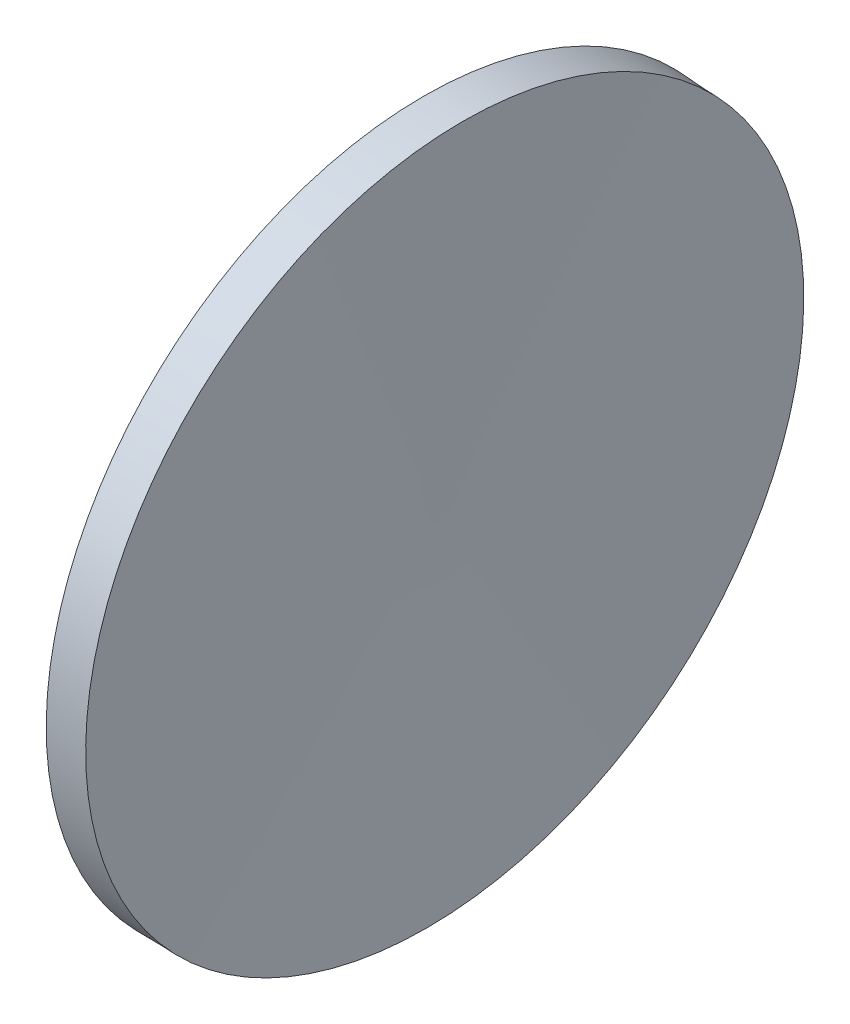
ISO-10303-21;
HEADER;
FILE_DESCRIPTION(('STEP AP214'),'2;1');
FILE_NAME('part.step','',(''),(''),'','','');
FILE_SCHEMA(('AUTOMOTIVE_DESIGN { 1 0 10303 214 1 1 1 1 }'));
ENDSEC;
DATA;
#1=APPLICATION_CONTEXT('core data for automotive mechanical design processes');
#2=APPLICATION_PROTOCOL_DEFINITION('international standard','automotive_design',2000,#1);
#3=PRODUCT_CONTEXT('',#1,'mechanical');
#4=PRODUCT('Part','Part','',(#3));
#5=PRODUCT_RELATED_PRODUCT_CATEGORY('part','',(#4));
#6=PRODUCT_DEFINITION_FORMATION('','',#4);
#7=PRODUCT_DEFINITION_CONTEXT('part definition',#1,'design');
#8=PRODUCT_DEFINITION('design','',#6,#7);
#9=PRODUCT_DEFINITION_SHAPE('','',#8);
#10=(LENGTH_UNIT() NAMED_UNIT(*) SI_UNIT(.MILLI.,.METRE.));
#11=(NAMED_UNIT(*) PLANE_ANGLE_UNIT() SI_UNIT($,.RADIAN.));
#12=(NAMED_UNIT(*) SI_UNIT($,.STERADIAN.) SOLID_ANGLE_UNIT());
#13=UNCERTAINTY_MEASURE_WITH_UNIT(LENGTH_MEASURE(1.E-05),#10,'distance_accuracy_value','');
#14=(GEOMETRIC_REPRESENTATION_CONTEXT(3) GLOBAL_UNCERTAINTY_ASSIGNED_CONTEXT((#13)) GLOBAL_UNIT_ASSIGNED_CONTEXT((#10,
#11,#12)) REPRESENTATION_CONTEXT('',''));
#15=CARTESIAN_POINT('',(0.,0.,0.));
#16=DIRECTION('',(0.,0.,1.));
#17=DIRECTION('',(1.,0.,0.));
#18=AXIS2_PLACEMENT_3D('',#15,#16,#17);
#19=CARTESIAN_POINT('',(-115.229820289862,0.229174747674089,0.));
#20=DIRECTION('',(-0.998758189918029,0.049820458364638,0.));
#21=DIRECTION('',(-0.049820458364638,-0.998758189918029,0.));
#22=AXIS2_PLACEMENT_3D('',#19,#20,#21);
#23=CONICAL_SURFACE('',#22,1.85512316674261,0.0150186490438481);
#24=CARTESIAN_POINT('',(-115.029037692505,0.219159229270396,0.));
#25=DIRECTION('',(-0.998758189918029,0.049820458364638,0.));
#26=DIRECTION('',(-0.049820458364638,-0.998758189918029,0.));
#27=AXIS2_PLACEMENT_3D('',#24,#25,#26);
#28=CIRCLE('',#27,1.85210370703888);
#29=CARTESIAN_POINT('',(-115.121310348128,-1.63064451671222,0.));
#30=VERTEX_POINT('',#29);
#31=EDGE_CURVE('E52',#30,#30,#28,.T.);
#32=ORIENTED_EDGE('',*,*,#31,.T.);
#33=EDGE_LOOP('',(#32));
#34=FACE_BOUND('',#33,.T.);
#35=CARTESIAN_POINT('',(-115.229820289862,0.229174747674089,0.));
#36=DIRECTION('',(-0.998758189918029,0.049820458364638,0.));
#37=DIRECTION('',(-0.049820458364638,-0.998758189918029,0.));
#38=AXIS2_PLACEMENT_3D('',#35,#36,#37);
#39=CIRCLE('',#38,1.85512316674261);
#40=CARTESIAN_POINT('',(-115.322243376352,-1.62364470841676,0.));
#41=VERTEX_POINT('',#40);
#42=EDGE_CURVE('E13',#41,#41,#39,.T.);
#43=ORIENTED_EDGE('',*,*,#42,.F.);
#44=EDGE_LOOP('',(#43));
#45=FACE_BOUND('',#44,.T.);
#46=ADVANCED_FACE('F46',(#34,#45),#23,.T.);
#47=CARTESIAN_POINT('',(-110.635519802166,0.,0.));
#48=DIRECTION('',(-0.998758189918029,0.049820458364638,0.));
#49=DIRECTION('',(0.049820458364638,0.998758189918029,0.));
#50=AXIS2_PLACEMENT_3D('',#47,#48,#49);
#51=SPHERICAL_SURFACE('',#50,4.96000000000001);
#52=ORIENTED_EDGE('',*,*,#42,.T.);
#53=EDGE_LOOP('',(#52));
#54=FACE_BOUND('',#53,.T.);
#55=ADVANCED_FACE('F57',(#54),#51,.T.);
#56=CARTESIAN_POINT('',(-115.056821334755,0.22054514410535,0.));
#57=DIRECTION('',(0.998758189918029,-0.049820458364638,0.));
#58=DIRECTION('',(0.049820458364638,0.998758189918029,0.));
#59=AXIS2_PLACEMENT_3D('',#56,#57,#58);
#60=CONICAL_SURFACE('',#59,0.,1.55577767775104);
#61=ORIENTED_EDGE('',*,*,#31,.F.);
#62=EDGE_LOOP('',(#61));
#63=FACE_BOUND('',#62,.T.);
#64=CARTESIAN_POINT('',(-115.056821334755,0.22054514410535,0.));
#65=VERTEX_POINT('',#64);
#66=VERTEX_LOOP('',#65);
#67=FACE_BOUND('',#66,.T.);
#68=ADVANCED_FACE('F55',(#63,#67),#60,.F.);
#69=CLOSED_SHELL('',(#46,#55,#68));
#70=MANIFOLD_SOLID_BREP('B2',#69);
#71=ADVANCED_BREP_SHAPE_REPRESENTATION('',(#18,#70),#14);
#72=SHAPE_DEFINITION_REPRESENTATION(#9,#71);
ENDSEC;
END-ISO-10303-21;
